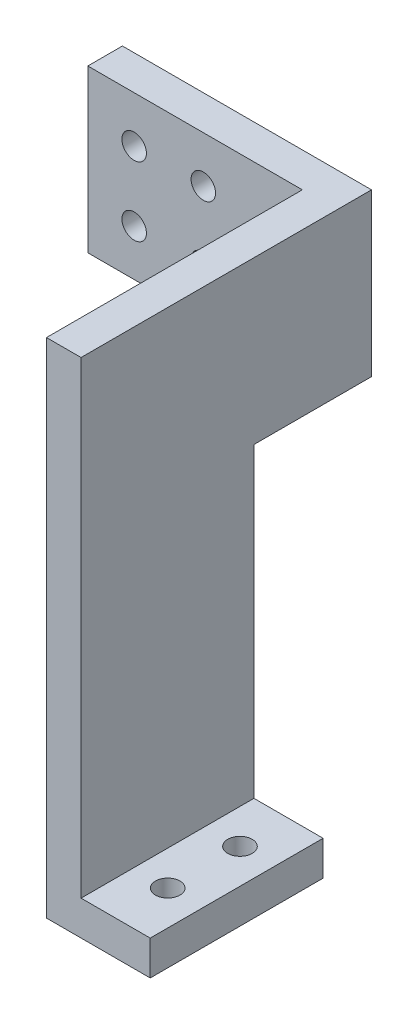
ISO-10303-21;
HEADER;
FILE_DESCRIPTION(('STEP AP214'),'2;1');
FILE_NAME('part.step','',(''),(''),'','','');
FILE_SCHEMA(('AUTOMOTIVE_DESIGN { 1 0 10303 214 1 1 1 1 }'));
ENDSEC;
DATA;
#1=APPLICATION_CONTEXT('core data for automotive mechanical design processes');
#2=APPLICATION_PROTOCOL_DEFINITION('international standard','automotive_design',2000,#1);
#3=PRODUCT_CONTEXT('',#1,'mechanical');
#4=PRODUCT('Part','Part','',(#3));
#5=PRODUCT_RELATED_PRODUCT_CATEGORY('part','',(#4));
#6=PRODUCT_DEFINITION_FORMATION('','',#4);
#7=PRODUCT_DEFINITION_CONTEXT('part definition',#1,'design');
#8=PRODUCT_DEFINITION('design','',#6,#7);
#9=PRODUCT_DEFINITION_SHAPE('','',#8);
#10=(LENGTH_UNIT() NAMED_UNIT(*) SI_UNIT(.MILLI.,.METRE.));
#11=(NAMED_UNIT(*) PLANE_ANGLE_UNIT() SI_UNIT($,.RADIAN.));
#12=(NAMED_UNIT(*) SI_UNIT($,.STERADIAN.) SOLID_ANGLE_UNIT());
#13=UNCERTAINTY_MEASURE_WITH_UNIT(LENGTH_MEASURE(1.E-05),#10,'distance_accuracy_value','');
#14=(GEOMETRIC_REPRESENTATION_CONTEXT(3) GLOBAL_UNCERTAINTY_ASSIGNED_CONTEXT((#13)) GLOBAL_UNIT_ASSIGNED_CONTEXT((#10,
#11,#12)) REPRESENTATION_CONTEXT('',''));
#15=CARTESIAN_POINT('',(0.,0.,0.));
#16=DIRECTION('',(0.,0.,1.));
#17=DIRECTION('',(1.,0.,0.));
#18=AXIS2_PLACEMENT_3D('',#15,#16,#17);
#19=CARTESIAN_POINT('',(-9.525,6.35,15.875));
#20=DIRECTION('',(1.,0.,0.));
#21=DIRECTION('',(0.,0.,-1.));
#22=AXIS2_PLACEMENT_3D('',#19,#20,#21);
#23=PLANE('',#22);
#24=DIRECTION('',(0.,1.,0.));
#25=VECTOR('',#24,1.);
#26=CARTESIAN_POINT('',(-9.525,92.3386012,-31.115));
#27=LINE('',#26,#25);
#28=CARTESIAN_POINT('',(-9.525,62.6206012,-31.115));
#29=VERTEX_POINT('',#28);
#30=CARTESIAN_POINT('',(-9.525,92.3386012,-31.115));
#31=VERTEX_POINT('',#30);
#32=EDGE_CURVE('E60',#29,#31,#27,.T.);
#33=ORIENTED_EDGE('',*,*,#32,.F.);
#34=DIRECTION('',(0.,0.,1.));
#35=VECTOR('',#34,1.);
#36=CARTESIAN_POINT('',(-9.525,62.6206012,-37.465));
#37=LINE('',#36,#35);
#38=CARTESIAN_POINT('',(-9.525,62.6206012,-15.875));
#39=VERTEX_POINT('',#38);
#40=EDGE_CURVE('E162',#29,#39,#37,.T.);
#41=ORIENTED_EDGE('',*,*,#40,.T.);
#42=DIRECTION('',(0.,-1.,0.));
#43=VECTOR('',#42,1.);
#44=CARTESIAN_POINT('',(-9.525,6.35,-15.875));
#45=LINE('',#44,#43);
#46=CARTESIAN_POINT('',(-9.525,0.,-15.875));
#47=VERTEX_POINT('',#46);
#48=EDGE_CURVE('E265',#39,#47,#45,.T.);
#49=ORIENTED_EDGE('',*,*,#48,.T.);
#50=DIRECTION('',(0.,0.,1.));
#51=VECTOR('',#50,1.);
#52=CARTESIAN_POINT('',(-9.525,0.,15.875));
#53=LINE('',#52,#51);
#54=CARTESIAN_POINT('',(-9.525,0.,15.875));
#55=VERTEX_POINT('',#54);
#56=EDGE_CURVE('E247',#47,#55,#53,.T.);
#57=ORIENTED_EDGE('',*,*,#56,.T.);
#58=DIRECTION('',(0.,-1.,0.));
#59=VECTOR('',#58,1.);
#60=CARTESIAN_POINT('',(-9.525,6.35,15.875));
#61=LINE('',#60,#59);
#62=CARTESIAN_POINT('',(-9.525,92.3386012,15.875));
#63=VERTEX_POINT('',#62);
#64=EDGE_CURVE('E13',#63,#55,#61,.T.);
#65=ORIENTED_EDGE('',*,*,#64,.F.);
#66=DIRECTION('',(0.,0.,1.));
#67=VECTOR('',#66,1.);
#68=CARTESIAN_POINT('',(-9.525,92.3386012,-15.875));
#69=LINE('',#68,#67);
#70=EDGE_CURVE('E299',#31,#63,#69,.T.);
#71=ORIENTED_EDGE('',*,*,#70,.F.);
#72=EDGE_LOOP('',(#33,#41,#49,#57,#65,#71));
#73=FACE_BOUND('',#72,.T.);
#74=ADVANCED_FACE('F44',(#73),#23,.F.);
#75=CARTESIAN_POINT('',(-9.525,6.35,-15.875));
#76=DIRECTION('',(0.,0.,1.));
#77=DIRECTION('',(1.,0.,0.));
#78=AXIS2_PLACEMENT_3D('',#75,#76,#77);
#79=PLANE('',#78);
#80=DIRECTION('',(-1.,0.,0.));
#81=VECTOR('',#80,1.);
#82=CARTESIAN_POINT('',(-3.17500000000001,62.6206012,-15.875));
#83=LINE('',#82,#81);
#84=CARTESIAN_POINT('',(-3.175,62.6206012,-15.875));
#85=VERTEX_POINT('',#84);
#86=EDGE_CURVE('E68',#85,#39,#83,.T.);
#87=ORIENTED_EDGE('',*,*,#86,.F.);
#88=DIRECTION('',(0.,-1.,0.));
#89=VECTOR('',#88,1.);
#90=CARTESIAN_POINT('',(-3.175,92.3386012,-15.875));
#91=LINE('',#90,#89);
#92=CARTESIAN_POINT('',(-3.175,6.35,-15.875));
#93=VERTEX_POINT('',#92);
#94=EDGE_CURVE('E271',#85,#93,#91,.T.);
#95=ORIENTED_EDGE('',*,*,#94,.T.);
#96=DIRECTION('',(-1.,0.,0.));
#97=VECTOR('',#96,1.);
#98=CARTESIAN_POINT('',(-9.525,6.35,-15.875));
#99=LINE('',#98,#97);
#100=CARTESIAN_POINT('',(9.525,6.35,-15.875));
#101=VERTEX_POINT('',#100);
#102=EDGE_CURVE('E268',#101,#93,#99,.T.);
#103=ORIENTED_EDGE('',*,*,#102,.F.);
#104=DIRECTION('',(0.,-1.,0.));
#105=VECTOR('',#104,1.);
#106=CARTESIAN_POINT('',(9.525,6.35,-15.875));
#107=LINE('',#106,#105);
#108=CARTESIAN_POINT('',(9.525,0.,-15.875));
#109=VERTEX_POINT('',#108);
#110=EDGE_CURVE('E252',#101,#109,#107,.T.);
#111=ORIENTED_EDGE('',*,*,#110,.T.);
#112=DIRECTION('',(-1.,0.,0.));
#113=VECTOR('',#112,1.);
#114=CARTESIAN_POINT('',(-9.525,0.,-15.875));
#115=LINE('',#114,#113);
#116=EDGE_CURVE('E256',#109,#47,#115,.T.);
#117=ORIENTED_EDGE('',*,*,#116,.T.);
#118=ORIENTED_EDGE('',*,*,#48,.F.);
#119=EDGE_LOOP('',(#87,#95,#103,#111,#117,#118));
#120=FACE_BOUND('',#119,.T.);
#121=ADVANCED_FACE('F213',(#120),#79,.F.);
#122=CARTESIAN_POINT('',(-9.525,6.35,-15.875));
#123=DIRECTION('',(0.,-1.,0.));
#124=DIRECTION('',(0.,0.,-1.));
#125=AXIS2_PLACEMENT_3D('',#122,#123,#124);
#126=PLANE('',#125);
#127=CARTESIAN_POINT('',(3.175,6.35,6.31314127093133));
#128=DIRECTION('',(0.,1.,0.));
#129=DIRECTION('',(0.,0.,1.));
#130=AXIS2_PLACEMENT_3D('',#127,#128,#129);
#131=CIRCLE('',#130,2.24999999999999);
#132=CARTESIAN_POINT('',(3.175,6.35,8.56314127093132));
#133=VERTEX_POINT('',#132);
#134=EDGE_CURVE('E358',#133,#133,#131,.T.);
#135=ORIENTED_EDGE('',*,*,#134,.F.);
#136=EDGE_LOOP('',(#135));
#137=FACE_BOUND('',#136,.T.);
#138=CARTESIAN_POINT('',(3.175,6.35,-6.95657886317535));
#139=DIRECTION('',(0.,1.,0.));
#140=DIRECTION('',(0.,0.,1.));
#141=AXIS2_PLACEMENT_3D('',#138,#139,#140);
#142=CIRCLE('',#141,2.24999999999999);
#143=CARTESIAN_POINT('',(3.175,6.35,-4.70657886317536));
#144=VERTEX_POINT('',#143);
#145=EDGE_CURVE('E360',#144,#144,#142,.T.);
#146=ORIENTED_EDGE('',*,*,#145,.F.);
#147=EDGE_LOOP('',(#146));
#148=FACE_BOUND('',#147,.T.);
#149=DIRECTION('',(0.,0.,-1.));
#150=VECTOR('',#149,1.);
#151=CARTESIAN_POINT('',(-3.175,6.35,-15.875));
#152=LINE('',#151,#150);
#153=CARTESIAN_POINT('',(-3.175,6.35,15.875));
#154=VERTEX_POINT('',#153);
#155=EDGE_CURVE('E279',#154,#93,#152,.T.);
#156=ORIENTED_EDGE('',*,*,#155,.F.);
#157=DIRECTION('',(1.,0.,0.));
#158=VECTOR('',#157,1.);
#159=CARTESIAN_POINT('',(-9.525,6.35,15.875));
#160=LINE('',#159,#158);
#161=CARTESIAN_POINT('',(9.525,6.35,15.875));
#162=VERTEX_POINT('',#161);
#163=EDGE_CURVE('E258',#154,#162,#160,.T.);
#164=ORIENTED_EDGE('',*,*,#163,.T.);
#165=DIRECTION('',(0.,0.,-1.));
#166=VECTOR('',#165,1.);
#167=CARTESIAN_POINT('',(9.525,6.35,15.875));
#168=LINE('',#167,#166);
#169=EDGE_CURVE('E251',#162,#101,#168,.T.);
#170=ORIENTED_EDGE('',*,*,#169,.T.);
#171=ORIENTED_EDGE('',*,*,#102,.T.);
#172=EDGE_LOOP('',(#156,#164,#170,#171));
#173=FACE_BOUND('',#172,.T.);
#174=ADVANCED_FACE('F217',(#137,#148,#173),#126,.F.);
#175=CARTESIAN_POINT('',(-9.525,6.35,15.875));
#176=DIRECTION('',(0.,0.,-1.));
#177=DIRECTION('',(-1.,0.,0.));
#178=AXIS2_PLACEMENT_3D('',#175,#176,#177);
#179=PLANE('',#178);
#180=DIRECTION('',(1.,0.,0.));
#181=VECTOR('',#180,1.);
#182=CARTESIAN_POINT('',(-9.525,0.,15.875));
#183=LINE('',#182,#181);
#184=CARTESIAN_POINT('',(9.525,0.,15.875));
#185=VERTEX_POINT('',#184);
#186=EDGE_CURVE('E236',#55,#185,#183,.T.);
#187=ORIENTED_EDGE('',*,*,#186,.T.);
#188=DIRECTION('',(0.,-1.,0.));
#189=VECTOR('',#188,1.);
#190=CARTESIAN_POINT('',(9.525,6.35,15.875));
#191=LINE('',#190,#189);
#192=EDGE_CURVE('E52',#162,#185,#191,.T.);
#193=ORIENTED_EDGE('',*,*,#192,.F.);
#194=ORIENTED_EDGE('',*,*,#163,.F.);
#195=DIRECTION('',(0.,-1.,0.));
#196=VECTOR('',#195,1.);
#197=CARTESIAN_POINT('',(-3.175,92.3386012,15.875));
#198=LINE('',#197,#196);
#199=CARTESIAN_POINT('',(-3.175,92.3386012,15.875));
#200=VERTEX_POINT('',#199);
#201=EDGE_CURVE('E274',#200,#154,#198,.T.);
#202=ORIENTED_EDGE('',*,*,#201,.F.);
#203=DIRECTION('',(1.,0.,0.));
#204=VECTOR('',#203,1.);
#205=CARTESIAN_POINT('',(-9.525,92.3386012,15.875));
#206=LINE('',#205,#204);
#207=EDGE_CURVE('E297',#63,#200,#206,.T.);
#208=ORIENTED_EDGE('',*,*,#207,.F.);
#209=ORIENTED_EDGE('',*,*,#64,.T.);
#210=EDGE_LOOP('',(#187,#193,#194,#202,#208,#209));
#211=FACE_BOUND('',#210,.T.);
#212=ADVANCED_FACE('F222',(#211),#179,.F.);
#213=CARTESIAN_POINT('',(9.525,6.35,15.875));
#214=DIRECTION('',(-1.,0.,0.));
#215=DIRECTION('',(0.,0.,1.));
#216=AXIS2_PLACEMENT_3D('',#213,#214,#215);
#217=PLANE('',#216);
#218=DIRECTION('',(0.,0.,-1.));
#219=VECTOR('',#218,1.);
#220=CARTESIAN_POINT('',(9.525,0.,15.875));
#221=LINE('',#220,#219);
#222=EDGE_CURVE('E246',#185,#109,#221,.T.);
#223=ORIENTED_EDGE('',*,*,#222,.T.);
#224=ORIENTED_EDGE('',*,*,#110,.F.);
#225=ORIENTED_EDGE('',*,*,#169,.F.);
#226=ORIENTED_EDGE('',*,*,#192,.T.);
#227=EDGE_LOOP('',(#223,#224,#225,#226));
#228=FACE_BOUND('',#227,.T.);
#229=ADVANCED_FACE('F228',(#228),#217,.F.);
#230=CARTESIAN_POINT('',(-9.525,0.,-15.875));
#231=DIRECTION('',(0.,-1.,0.));
#232=DIRECTION('',(0.,0.,-1.));
#233=AXIS2_PLACEMENT_3D('',#230,#231,#232);
#234=PLANE('',#233);
#235=CARTESIAN_POINT('',(3.175,0.,6.31314127093133));
#236=DIRECTION('',(0.,-1.,0.));
#237=DIRECTION('',(0.,0.,-1.));
#238=AXIS2_PLACEMENT_3D('',#235,#236,#237);
#239=CIRCLE('',#238,2.24999999999999);
#240=CARTESIAN_POINT('',(3.175,0.,4.06314127093134));
#241=VERTEX_POINT('',#240);
#242=EDGE_CURVE('E355',#241,#241,#239,.T.);
#243=ORIENTED_EDGE('',*,*,#242,.F.);
#244=EDGE_LOOP('',(#243));
#245=FACE_BOUND('',#244,.T.);
#246=CARTESIAN_POINT('',(3.175,0.,-6.95657886317535));
#247=DIRECTION('',(0.,-1.,0.));
#248=DIRECTION('',(0.,0.,-1.));
#249=AXIS2_PLACEMENT_3D('',#246,#247,#248);
#250=CIRCLE('',#249,2.24999999999999);
#251=CARTESIAN_POINT('',(3.175,0.,-9.20657886317534));
#252=VERTEX_POINT('',#251);
#253=EDGE_CURVE('E364',#252,#252,#250,.T.);
#254=ORIENTED_EDGE('',*,*,#253,.F.);
#255=EDGE_LOOP('',(#254));
#256=FACE_BOUND('',#255,.T.);
#257=ORIENTED_EDGE('',*,*,#56,.F.);
#258=ORIENTED_EDGE('',*,*,#116,.F.);
#259=ORIENTED_EDGE('',*,*,#222,.F.);
#260=ORIENTED_EDGE('',*,*,#186,.F.);
#261=EDGE_LOOP('',(#257,#258,#259,#260));
#262=FACE_BOUND('',#261,.T.);
#263=ADVANCED_FACE('F227',(#245,#256,#262),#234,.T.);
#264=CARTESIAN_POINT('',(-3.175,92.3386012,-15.875));
#265=DIRECTION('',(-1.,0.,0.));
#266=DIRECTION('',(0.,0.,1.));
#267=AXIS2_PLACEMENT_3D('',#264,#265,#266);
#268=PLANE('',#267);
#269=ORIENTED_EDGE('',*,*,#155,.T.);
#270=ORIENTED_EDGE('',*,*,#94,.F.);
#271=DIRECTION('',(0.,0.,1.));
#272=VECTOR('',#271,1.);
#273=CARTESIAN_POINT('',(-3.17500000000001,62.6206012,-37.465));
#274=LINE('',#273,#272);
#275=CARTESIAN_POINT('',(-3.17500000000001,62.6206012,-37.465));
#276=VERTEX_POINT('',#275);
#277=EDGE_CURVE('E306',#276,#85,#274,.T.);
#278=ORIENTED_EDGE('',*,*,#277,.F.);
#279=DIRECTION('',(0.,-1.,0.));
#280=VECTOR('',#279,1.);
#281=CARTESIAN_POINT('',(-3.175,92.3386012,-37.465));
#282=LINE('',#281,#280);
#283=CARTESIAN_POINT('',(-3.175,92.3386012,-37.465));
#284=VERTEX_POINT('',#283);
#285=EDGE_CURVE('E130',#284,#276,#282,.T.);
#286=ORIENTED_EDGE('',*,*,#285,.F.);
#287=DIRECTION('',(0.,0.,-1.));
#288=VECTOR('',#287,1.);
#289=CARTESIAN_POINT('',(-3.175,92.3386012,-15.875));
#290=LINE('',#289,#288);
#291=EDGE_CURVE('E275',#200,#284,#290,.T.);
#292=ORIENTED_EDGE('',*,*,#291,.F.);
#293=ORIENTED_EDGE('',*,*,#201,.T.);
#294=EDGE_LOOP('',(#269,#270,#278,#286,#292,#293));
#295=FACE_BOUND('',#294,.T.);
#296=ADVANCED_FACE('F309',(#295),#268,.F.);
#297=CARTESIAN_POINT('',(-9.525,92.3386012,15.875));
#298=DIRECTION('',(0.,1.,0.));
#299=DIRECTION('',(0.,0.,1.));
#300=AXIS2_PLACEMENT_3D('',#297,#298,#299);
#301=PLANE('',#300);
#302=DIRECTION('',(1.,0.,0.));
#303=VECTOR('',#302,1.);
#304=CARTESIAN_POINT('',(-3.175,92.3386012,-37.465));
#305=LINE('',#304,#303);
#306=CARTESIAN_POINT('',(-48.924,92.3386012,-37.465));
#307=VERTEX_POINT('',#306);
#308=EDGE_CURVE('E134',#307,#284,#305,.T.);
#309=ORIENTED_EDGE('',*,*,#308,.F.);
#310=DIRECTION('',(0.,0.,-1.));
#311=VECTOR('',#310,1.);
#312=CARTESIAN_POINT('',(-48.924,92.3386012,-37.465));
#313=LINE('',#312,#311);
#314=CARTESIAN_POINT('',(-48.924,92.3386012,-31.115));
#315=VERTEX_POINT('',#314);
#316=EDGE_CURVE('E148',#315,#307,#313,.T.);
#317=ORIENTED_EDGE('',*,*,#316,.F.);
#318=DIRECTION('',(1.,0.,0.));
#319=VECTOR('',#318,1.);
#320=CARTESIAN_POINT('',(-48.924,92.3386012,-31.115));
#321=LINE('',#320,#319);
#322=EDGE_CURVE('E157',#315,#31,#321,.T.);
#323=ORIENTED_EDGE('',*,*,#322,.T.);
#324=ORIENTED_EDGE('',*,*,#70,.T.);
#325=ORIENTED_EDGE('',*,*,#207,.T.);
#326=ORIENTED_EDGE('',*,*,#291,.T.);
#327=EDGE_LOOP('',(#309,#317,#323,#324,#325,#326));
#328=FACE_BOUND('',#327,.T.);
#329=ADVANCED_FACE('F311',(#328),#301,.T.);
#330=CARTESIAN_POINT('',(-3.17500000000001,62.6206012,-37.465));
#331=DIRECTION('',(0.,1.,0.));
#332=DIRECTION('',(0.,0.,1.));
#333=AXIS2_PLACEMENT_3D('',#330,#331,#332);
#334=PLANE('',#333);
#335=ORIENTED_EDGE('',*,*,#86,.T.);
#336=ORIENTED_EDGE('',*,*,#40,.F.);
#337=DIRECTION('',(1.,0.,0.));
#338=VECTOR('',#337,1.);
#339=CARTESIAN_POINT('',(-48.924,62.6206012,-31.115));
#340=LINE('',#339,#338);
#341=CARTESIAN_POINT('',(-48.924,62.6206012,-31.115));
#342=VERTEX_POINT('',#341);
#343=EDGE_CURVE('E140',#342,#29,#340,.T.);
#344=ORIENTED_EDGE('',*,*,#343,.F.);
#345=DIRECTION('',(0.,0.,1.));
#346=VECTOR('',#345,1.);
#347=CARTESIAN_POINT('',(-48.924,62.6206012,-37.465));
#348=LINE('',#347,#346);
#349=CARTESIAN_POINT('',(-48.924,62.6206012,-37.465));
#350=VERTEX_POINT('',#349);
#351=EDGE_CURVE('E137',#350,#342,#348,.T.);
#352=ORIENTED_EDGE('',*,*,#351,.F.);
#353=DIRECTION('',(-1.,0.,0.));
#354=VECTOR('',#353,1.);
#355=CARTESIAN_POINT('',(-3.17500000000001,62.6206012,-37.465));
#356=LINE('',#355,#354);
#357=EDGE_CURVE('E123',#276,#350,#356,.T.);
#358=ORIENTED_EDGE('',*,*,#357,.F.);
#359=ORIENTED_EDGE('',*,*,#277,.T.);
#360=EDGE_LOOP('',(#335,#336,#344,#352,#358,#359));
#361=FACE_BOUND('',#360,.T.);
#362=ADVANCED_FACE('F138',(#361),#334,.F.);
#363=CARTESIAN_POINT('',(-3.17500000000001,62.6206012,-37.465));
#364=DIRECTION('',(0.,0.,-1.));
#365=DIRECTION('',(-1.,0.,0.));
#366=AXIS2_PLACEMENT_3D('',#363,#364,#365);
#367=PLANE('',#366);
#368=CARTESIAN_POINT('',(-40.415,71.1296012,-37.465));
#369=DIRECTION('',(0.,0.,-1.));
#370=DIRECTION('',(-1.,0.,0.));
#371=AXIS2_PLACEMENT_3D('',#368,#369,#370);
#372=CIRCLE('',#371,2.24999999999999);
#373=CARTESIAN_POINT('',(-42.6649999999999,71.1296012,-37.465));
#374=VERTEX_POINT('',#373);
#375=EDGE_CURVE('E188',#374,#374,#372,.T.);
#376=ORIENTED_EDGE('',*,*,#375,.F.);
#377=EDGE_LOOP('',(#376));
#378=FACE_BOUND('',#377,.T.);
#379=CARTESIAN_POINT('',(-27.715,71.1296012,-37.465));
#380=DIRECTION('',(0.,0.,-1.));
#381=DIRECTION('',(-1.,0.,0.));
#382=AXIS2_PLACEMENT_3D('',#379,#380,#381);
#383=CIRCLE('',#382,2.24999999999999);
#384=CARTESIAN_POINT('',(-29.965,71.1296012,-37.465));
#385=VERTEX_POINT('',#384);
#386=EDGE_CURVE('E178',#385,#385,#383,.T.);
#387=ORIENTED_EDGE('',*,*,#386,.F.);
#388=EDGE_LOOP('',(#387));
#389=FACE_BOUND('',#388,.T.);
#390=CARTESIAN_POINT('',(-27.715,83.8296012,-37.465));
#391=DIRECTION('',(0.,0.,-1.));
#392=DIRECTION('',(-1.,0.,0.));
#393=AXIS2_PLACEMENT_3D('',#390,#391,#392);
#394=CIRCLE('',#393,2.24999999999999);
#395=CARTESIAN_POINT('',(-29.965,83.8296012,-37.465));
#396=VERTEX_POINT('',#395);
#397=EDGE_CURVE('E175',#396,#396,#394,.T.);
#398=ORIENTED_EDGE('',*,*,#397,.F.);
#399=EDGE_LOOP('',(#398));
#400=FACE_BOUND('',#399,.T.);
#401=CARTESIAN_POINT('',(-40.415,83.8296012,-37.465));
#402=DIRECTION('',(0.,0.,-1.));
#403=DIRECTION('',(-1.,0.,0.));
#404=AXIS2_PLACEMENT_3D('',#401,#402,#403);
#405=CIRCLE('',#404,2.24999999999999);
#406=CARTESIAN_POINT('',(-42.6649999999999,83.8296012,-37.465));
#407=VERTEX_POINT('',#406);
#408=EDGE_CURVE('E174',#407,#407,#405,.T.);
#409=ORIENTED_EDGE('',*,*,#408,.F.);
#410=EDGE_LOOP('',(#409));
#411=FACE_BOUND('',#410,.T.);
#412=ORIENTED_EDGE('',*,*,#285,.T.);
#413=ORIENTED_EDGE('',*,*,#357,.T.);
#414=DIRECTION('',(0.,-1.,0.));
#415=VECTOR('',#414,1.);
#416=CARTESIAN_POINT('',(-48.924,92.3386012,-37.465));
#417=LINE('',#416,#415);
#418=EDGE_CURVE('E128',#307,#350,#417,.T.);
#419=ORIENTED_EDGE('',*,*,#418,.F.);
#420=ORIENTED_EDGE('',*,*,#308,.T.);
#421=EDGE_LOOP('',(#412,#413,#419,#420));
#422=FACE_BOUND('',#421,.T.);
#423=ADVANCED_FACE('F125',(#378,#389,#400,#411,#422),#367,.T.);
#424=CARTESIAN_POINT('',(-48.924,92.3386012,-31.115));
#425=DIRECTION('',(0.,0.,-1.));
#426=DIRECTION('',(0.,1.,0.));
#427=AXIS2_PLACEMENT_3D('',#424,#425,#426);
#428=PLANE('',#427);
#429=CARTESIAN_POINT('',(-40.415,71.1296012,-31.115));
#430=DIRECTION('',(0.,0.,-1.));
#431=DIRECTION('',(0.,1.,0.));
#432=AXIS2_PLACEMENT_3D('',#429,#430,#431);
#433=CIRCLE('',#432,2.24999999999999);
#434=CARTESIAN_POINT('',(-40.415,73.3796012,-31.115));
#435=VERTEX_POINT('',#434);
#436=EDGE_CURVE('E47',#435,#435,#433,.T.);
#437=ORIENTED_EDGE('',*,*,#436,.T.);
#438=EDGE_LOOP('',(#437));
#439=FACE_BOUND('',#438,.T.);
#440=CARTESIAN_POINT('',(-27.715,71.1296012,-31.115));
#441=DIRECTION('',(0.,0.,-1.));
#442=DIRECTION('',(0.,1.,0.));
#443=AXIS2_PLACEMENT_3D('',#440,#441,#442);
#444=CIRCLE('',#443,2.24999999999999);
#445=CARTESIAN_POINT('',(-27.715,73.3796012,-31.115));
#446=VERTEX_POINT('',#445);
#447=EDGE_CURVE('E176',#446,#446,#444,.T.);
#448=ORIENTED_EDGE('',*,*,#447,.T.);
#449=EDGE_LOOP('',(#448));
#450=FACE_BOUND('',#449,.T.);
#451=CARTESIAN_POINT('',(-27.715,83.8296012,-31.115));
#452=DIRECTION('',(0.,0.,-1.));
#453=DIRECTION('',(0.,1.,0.));
#454=AXIS2_PLACEMENT_3D('',#451,#452,#453);
#455=CIRCLE('',#454,2.24999999999999);
#456=CARTESIAN_POINT('',(-27.715,86.0796012,-31.115));
#457=VERTEX_POINT('',#456);
#458=EDGE_CURVE('E172',#457,#457,#455,.T.);
#459=ORIENTED_EDGE('',*,*,#458,.T.);
#460=EDGE_LOOP('',(#459));
#461=FACE_BOUND('',#460,.T.);
#462=CARTESIAN_POINT('',(-40.415,83.8296012,-31.115));
#463=DIRECTION('',(0.,0.,-1.));
#464=DIRECTION('',(0.,1.,0.));
#465=AXIS2_PLACEMENT_3D('',#462,#463,#464);
#466=CIRCLE('',#465,2.24999999999999);
#467=CARTESIAN_POINT('',(-40.415,86.0796012,-31.115));
#468=VERTEX_POINT('',#467);
#469=EDGE_CURVE('E150',#468,#468,#466,.T.);
#470=ORIENTED_EDGE('',*,*,#469,.T.);
#471=EDGE_LOOP('',(#470));
#472=FACE_BOUND('',#471,.T.);
#473=ORIENTED_EDGE('',*,*,#32,.T.);
#474=ORIENTED_EDGE('',*,*,#322,.F.);
#475=DIRECTION('',(0.,1.,0.));
#476=VECTOR('',#475,1.);
#477=CARTESIAN_POINT('',(-48.924,92.3386012,-31.115));
#478=LINE('',#477,#476);
#479=EDGE_CURVE('E143',#342,#315,#478,.T.);
#480=ORIENTED_EDGE('',*,*,#479,.F.);
#481=ORIENTED_EDGE('',*,*,#343,.T.);
#482=EDGE_LOOP('',(#473,#474,#480,#481));
#483=FACE_BOUND('',#482,.T.);
#484=ADVANCED_FACE('F197',(#439,#450,#461,#472,#483),#428,.F.);
#485=CARTESIAN_POINT('',(-48.924,62.6206012,-37.465));
#486=DIRECTION('',(-1.,0.,0.));
#487=DIRECTION('',(0.,0.,1.));
#488=AXIS2_PLACEMENT_3D('',#485,#486,#487);
#489=PLANE('',#488);
#490=ORIENTED_EDGE('',*,*,#418,.T.);
#491=ORIENTED_EDGE('',*,*,#351,.T.);
#492=ORIENTED_EDGE('',*,*,#479,.T.);
#493=ORIENTED_EDGE('',*,*,#316,.T.);
#494=EDGE_LOOP('',(#490,#491,#492,#493));
#495=FACE_BOUND('',#494,.T.);
#496=ADVANCED_FACE('F146',(#495),#489,.T.);
#497=CARTESIAN_POINT('',(-40.415,83.8296012,-37.465));
#498=DIRECTION('',(0.,0.,-1.));
#499=DIRECTION('',(-1.,0.,0.));
#500=AXIS2_PLACEMENT_3D('',#497,#498,#499);
#501=CYLINDRICAL_SURFACE('',#500,2.24999999999999);
#502=ORIENTED_EDGE('',*,*,#408,.T.);
#503=EDGE_LOOP('',(#502));
#504=FACE_BOUND('',#503,.T.);
#505=ORIENTED_EDGE('',*,*,#469,.F.);
#506=EDGE_LOOP('',(#505));
#507=FACE_BOUND('',#506,.T.);
#508=ADVANCED_FACE('F200',(#504,#507),#501,.F.);
#509=CARTESIAN_POINT('',(-27.715,83.8296012,-37.465));
#510=DIRECTION('',(0.,0.,-1.));
#511=DIRECTION('',(-1.,0.,0.));
#512=AXIS2_PLACEMENT_3D('',#509,#510,#511);
#513=CYLINDRICAL_SURFACE('',#512,2.24999999999999);
#514=ORIENTED_EDGE('',*,*,#397,.T.);
#515=EDGE_LOOP('',(#514));
#516=FACE_BOUND('',#515,.T.);
#517=ORIENTED_EDGE('',*,*,#458,.F.);
#518=EDGE_LOOP('',(#517));
#519=FACE_BOUND('',#518,.T.);
#520=ADVANCED_FACE('F202',(#516,#519),#513,.F.);
#521=CARTESIAN_POINT('',(-27.715,71.1296012,-37.465));
#522=DIRECTION('',(0.,0.,-1.));
#523=DIRECTION('',(-1.,0.,0.));
#524=AXIS2_PLACEMENT_3D('',#521,#522,#523);
#525=CYLINDRICAL_SURFACE('',#524,2.24999999999999);
#526=ORIENTED_EDGE('',*,*,#386,.T.);
#527=EDGE_LOOP('',(#526));
#528=FACE_BOUND('',#527,.T.);
#529=ORIENTED_EDGE('',*,*,#447,.F.);
#530=EDGE_LOOP('',(#529));
#531=FACE_BOUND('',#530,.T.);
#532=ADVANCED_FACE('F208',(#528,#531),#525,.F.);
#533=CARTESIAN_POINT('',(-40.415,71.1296012,-37.465));
#534=DIRECTION('',(0.,0.,-1.));
#535=DIRECTION('',(-1.,0.,0.));
#536=AXIS2_PLACEMENT_3D('',#533,#534,#535);
#537=CYLINDRICAL_SURFACE('',#536,2.24999999999999);
#538=ORIENTED_EDGE('',*,*,#375,.T.);
#539=EDGE_LOOP('',(#538));
#540=FACE_BOUND('',#539,.T.);
#541=ORIENTED_EDGE('',*,*,#436,.F.);
#542=EDGE_LOOP('',(#541));
#543=FACE_BOUND('',#542,.T.);
#544=ADVANCED_FACE('F333',(#540,#543),#537,.F.);
#545=CARTESIAN_POINT('',(3.175,6.35,-6.95657886317535));
#546=DIRECTION('',(0.,1.,0.));
#547=DIRECTION('',(0.,0.,1.));
#548=AXIS2_PLACEMENT_3D('',#545,#546,#547);
#549=CYLINDRICAL_SURFACE('',#548,2.24999999999999);
#550=ORIENTED_EDGE('',*,*,#253,.T.);
#551=EDGE_LOOP('',(#550));
#552=FACE_BOUND('',#551,.T.);
#553=ORIENTED_EDGE('',*,*,#145,.T.);
#554=EDGE_LOOP('',(#553));
#555=FACE_BOUND('',#554,.T.);
#556=ADVANCED_FACE('F335',(#552,#555),#549,.F.);
#557=CARTESIAN_POINT('',(3.175,6.35,6.31314127093133));
#558=DIRECTION('',(0.,1.,0.));
#559=DIRECTION('',(0.,0.,1.));
#560=AXIS2_PLACEMENT_3D('',#557,#558,#559);
#561=CYLINDRICAL_SURFACE('',#560,2.24999999999999);
#562=ORIENTED_EDGE('',*,*,#242,.T.);
#563=EDGE_LOOP('',(#562));
#564=FACE_BOUND('',#563,.T.);
#565=ORIENTED_EDGE('',*,*,#134,.T.);
#566=EDGE_LOOP('',(#565));
#567=FACE_BOUND('',#566,.T.);
#568=ADVANCED_FACE('F342',(#564,#567),#561,.F.);
#569=CLOSED_SHELL('',(#74,#121,#174,#212,#229,#263,#296,#329,#362,#423,#484,#496,#508,#520,#532,
#544,#556,#568));
#570=MANIFOLD_SOLID_BREP('B2',#569);
#571=ADVANCED_BREP_SHAPE_REPRESENTATION('',(#18,#570),#14);
#572=SHAPE_DEFINITION_REPRESENTATION(#9,#571);
ENDSEC;
END-ISO-10303-21;
